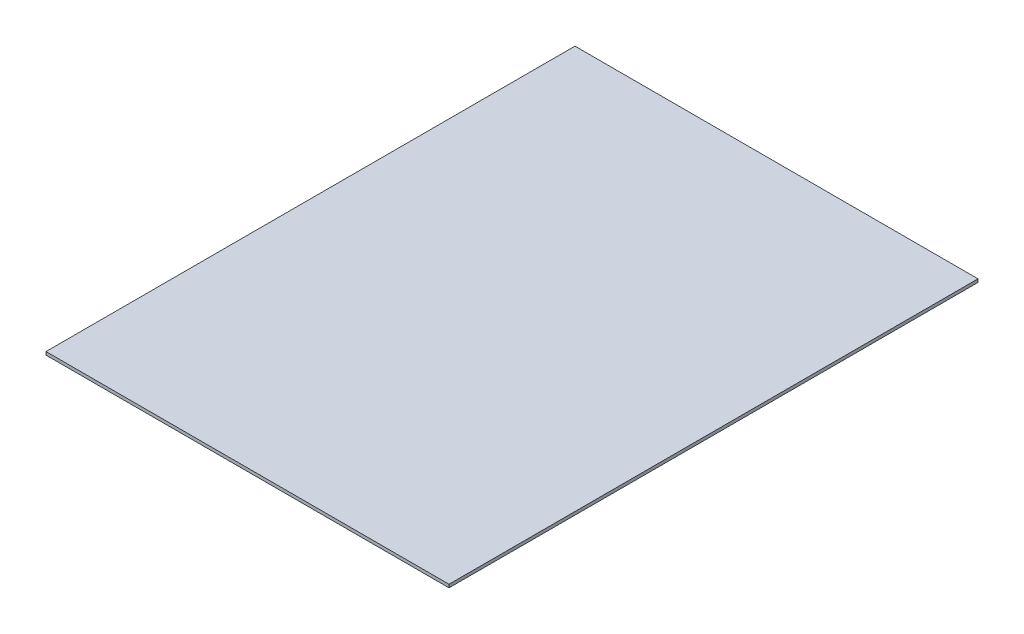
ISO-10303-21;
HEADER;
FILE_DESCRIPTION(('STEP AP214'),'2;1');
FILE_NAME('part.step','',(''),(''),'','','');
FILE_SCHEMA(('AUTOMOTIVE_DESIGN { 1 0 10303 214 1 1 1 1 }'));
ENDSEC;
DATA;
#1=APPLICATION_CONTEXT('core data for automotive mechanical design processes');
#2=APPLICATION_PROTOCOL_DEFINITION('international standard','automotive_design',2000,#1);
#3=PRODUCT_CONTEXT('',#1,'mechanical');
#4=PRODUCT('Part','Part','',(#3));
#5=PRODUCT_RELATED_PRODUCT_CATEGORY('part','',(#4));
#6=PRODUCT_DEFINITION_FORMATION('','',#4);
#7=PRODUCT_DEFINITION_CONTEXT('part definition',#1,'design');
#8=PRODUCT_DEFINITION('design','',#6,#7);
#9=PRODUCT_DEFINITION_SHAPE('','',#8);
#10=(LENGTH_UNIT() NAMED_UNIT(*) SI_UNIT(.MILLI.,.METRE.));
#11=(NAMED_UNIT(*) PLANE_ANGLE_UNIT() SI_UNIT($,.RADIAN.));
#12=(NAMED_UNIT(*) SI_UNIT($,.STERADIAN.) SOLID_ANGLE_UNIT());
#13=UNCERTAINTY_MEASURE_WITH_UNIT(LENGTH_MEASURE(1.E-05),#10,'distance_accuracy_value','');
#14=(GEOMETRIC_REPRESENTATION_CONTEXT(3) GLOBAL_UNCERTAINTY_ASSIGNED_CONTEXT((#13)) GLOBAL_UNIT_ASSIGNED_CONTEXT((#10,
#11,#12)) REPRESENTATION_CONTEXT('',''));
#15=CARTESIAN_POINT('',(0.,0.,0.));
#16=DIRECTION('',(0.,0.,1.));
#17=DIRECTION('',(1.,0.,0.));
#18=AXIS2_PLACEMENT_3D('',#15,#16,#17);
#19=CARTESIAN_POINT('',(203.2,3.175,266.7));
#20=DIRECTION('',(-1.,0.,0.));
#21=DIRECTION('',(0.,0.,1.));
#22=AXIS2_PLACEMENT_3D('',#19,#20,#21);
#23=PLANE('',#22);
#24=DIRECTION('',(0.,0.,-1.));
#25=VECTOR('',#24,1.);
#26=CARTESIAN_POINT('',(203.2,0.,266.7));
#27=LINE('',#26,#25);
#28=CARTESIAN_POINT('',(203.2,0.,266.7));
#29=VERTEX_POINT('',#28);
#30=CARTESIAN_POINT('',(203.2,0.,-266.7));
#31=VERTEX_POINT('',#30);
#32=EDGE_CURVE('E103',#29,#31,#27,.T.);
#33=ORIENTED_EDGE('',*,*,#32,.T.);
#34=DIRECTION('',(0.,-1.,0.));
#35=VECTOR('',#34,1.);
#36=CARTESIAN_POINT('',(203.2,3.175,-266.7));
#37=LINE('',#36,#35);
#38=CARTESIAN_POINT('',(203.2,3.175,-266.7));
#39=VERTEX_POINT('',#38);
#40=EDGE_CURVE('E11',#39,#31,#37,.T.);
#41=ORIENTED_EDGE('',*,*,#40,.F.);
#42=DIRECTION('',(0.,0.,-1.));
#43=VECTOR('',#42,1.);
#44=CARTESIAN_POINT('',(203.2,3.175,266.7));
#45=LINE('',#44,#43);
#46=CARTESIAN_POINT('',(203.2,3.175,266.7));
#47=VERTEX_POINT('',#46);
#48=EDGE_CURVE('E91',#47,#39,#45,.T.);
#49=ORIENTED_EDGE('',*,*,#48,.F.);
#50=DIRECTION('',(0.,-1.,0.));
#51=VECTOR('',#50,1.);
#52=CARTESIAN_POINT('',(203.2,3.175,266.7));
#53=LINE('',#52,#51);
#54=EDGE_CURVE('E99',#47,#29,#53,.T.);
#55=ORIENTED_EDGE('',*,*,#54,.T.);
#56=EDGE_LOOP('',(#33,#41,#49,#55));
#57=FACE_BOUND('',#56,.T.);
#58=ADVANCED_FACE('F40',(#57),#23,.F.);
#59=CARTESIAN_POINT('',(-203.2,3.175,-266.7));
#60=DIRECTION('',(0.,0.,1.));
#61=DIRECTION('',(1.,0.,0.));
#62=AXIS2_PLACEMENT_3D('',#59,#60,#61);
#63=PLANE('',#62);
#64=DIRECTION('',(-1.,0.,0.));
#65=VECTOR('',#64,1.);
#66=CARTESIAN_POINT('',(-203.2,0.,-266.7));
#67=LINE('',#66,#65);
#68=CARTESIAN_POINT('',(-203.2,0.,-266.7));
#69=VERTEX_POINT('',#68);
#70=EDGE_CURVE('E95',#31,#69,#67,.T.);
#71=ORIENTED_EDGE('',*,*,#70,.T.);
#72=DIRECTION('',(0.,-1.,0.));
#73=VECTOR('',#72,1.);
#74=CARTESIAN_POINT('',(-203.2,3.175,-266.7));
#75=LINE('',#74,#73);
#76=CARTESIAN_POINT('',(-203.2,3.175,-266.7));
#77=VERTEX_POINT('',#76);
#78=EDGE_CURVE('E48',#77,#69,#75,.T.);
#79=ORIENTED_EDGE('',*,*,#78,.F.);
#80=DIRECTION('',(-1.,0.,0.));
#81=VECTOR('',#80,1.);
#82=CARTESIAN_POINT('',(-203.2,3.175,-266.7));
#83=LINE('',#82,#81);
#84=EDGE_CURVE('E86',#39,#77,#83,.T.);
#85=ORIENTED_EDGE('',*,*,#84,.F.);
#86=ORIENTED_EDGE('',*,*,#40,.T.);
#87=EDGE_LOOP('',(#71,#79,#85,#86));
#88=FACE_BOUND('',#87,.T.);
#89=ADVANCED_FACE('F94',(#88),#63,.F.);
#90=CARTESIAN_POINT('',(-203.2,3.175,266.7));
#91=DIRECTION('',(1.,0.,0.));
#92=DIRECTION('',(0.,0.,-1.));
#93=AXIS2_PLACEMENT_3D('',#90,#91,#92);
#94=PLANE('',#93);
#95=DIRECTION('',(0.,0.,1.));
#96=VECTOR('',#95,1.);
#97=CARTESIAN_POINT('',(-203.2,0.,266.7));
#98=LINE('',#97,#96);
#99=CARTESIAN_POINT('',(-203.2,0.,266.7));
#100=VERTEX_POINT('',#99);
#101=EDGE_CURVE('E73',#69,#100,#98,.T.);
#102=ORIENTED_EDGE('',*,*,#101,.T.);
#103=DIRECTION('',(0.,-1.,0.));
#104=VECTOR('',#103,1.);
#105=CARTESIAN_POINT('',(-203.2,3.175,266.7));
#106=LINE('',#105,#104);
#107=CARTESIAN_POINT('',(-203.2,3.175,266.7));
#108=VERTEX_POINT('',#107);
#109=EDGE_CURVE('E96',#108,#100,#106,.T.);
#110=ORIENTED_EDGE('',*,*,#109,.F.);
#111=DIRECTION('',(0.,0.,1.));
#112=VECTOR('',#111,1.);
#113=CARTESIAN_POINT('',(-203.2,3.175,266.7));
#114=LINE('',#113,#112);
#115=EDGE_CURVE('E89',#77,#108,#114,.T.);
#116=ORIENTED_EDGE('',*,*,#115,.F.);
#117=ORIENTED_EDGE('',*,*,#78,.T.);
#118=EDGE_LOOP('',(#102,#110,#116,#117));
#119=FACE_BOUND('',#118,.T.);
#120=ADVANCED_FACE('F97',(#119),#94,.F.);
#121=CARTESIAN_POINT('',(-203.2,3.175,266.7));
#122=DIRECTION('',(0.,0.,-1.));
#123=DIRECTION('',(-1.,0.,0.));
#124=AXIS2_PLACEMENT_3D('',#121,#122,#123);
#125=PLANE('',#124);
#126=DIRECTION('',(1.,0.,0.));
#127=VECTOR('',#126,1.);
#128=CARTESIAN_POINT('',(-203.2,0.,266.7));
#129=LINE('',#128,#127);
#130=EDGE_CURVE('E79',#100,#29,#129,.T.);
#131=ORIENTED_EDGE('',*,*,#130,.T.);
#132=ORIENTED_EDGE('',*,*,#54,.F.);
#133=DIRECTION('',(1.,0.,0.));
#134=VECTOR('',#133,1.);
#135=CARTESIAN_POINT('',(-203.2,3.175,266.7));
#136=LINE('',#135,#134);
#137=EDGE_CURVE('E56',#108,#47,#136,.T.);
#138=ORIENTED_EDGE('',*,*,#137,.F.);
#139=ORIENTED_EDGE('',*,*,#109,.T.);
#140=EDGE_LOOP('',(#131,#132,#138,#139));
#141=FACE_BOUND('',#140,.T.);
#142=ADVANCED_FACE('F110',(#141),#125,.F.);
#143=CARTESIAN_POINT('',(0.,3.175,0.));
#144=DIRECTION('',(0.,-1.,0.));
#145=DIRECTION('',(0.,0.,-1.));
#146=AXIS2_PLACEMENT_3D('',#143,#144,#145);
#147=PLANE('',#146);
#148=ORIENTED_EDGE('',*,*,#48,.T.);
#149=ORIENTED_EDGE('',*,*,#84,.T.);
#150=ORIENTED_EDGE('',*,*,#115,.T.);
#151=ORIENTED_EDGE('',*,*,#137,.T.);
#152=EDGE_LOOP('',(#148,#149,#150,#151));
#153=FACE_BOUND('',#152,.T.);
#154=ADVANCED_FACE('F87',(#153),#147,.F.);
#155=CARTESIAN_POINT('',(0.,0.,0.));
#156=DIRECTION('',(0.,-1.,0.));
#157=DIRECTION('',(0.,0.,-1.));
#158=AXIS2_PLACEMENT_3D('',#155,#156,#157);
#159=PLANE('',#158);
#160=ORIENTED_EDGE('',*,*,#32,.F.);
#161=ORIENTED_EDGE('',*,*,#130,.F.);
#162=ORIENTED_EDGE('',*,*,#101,.F.);
#163=ORIENTED_EDGE('',*,*,#70,.F.);
#164=EDGE_LOOP('',(#160,#161,#162,#163));
#165=FACE_BOUND('',#164,.T.);
#166=ADVANCED_FACE('F113',(#165),#159,.T.);
#167=CLOSED_SHELL('',(#58,#89,#120,#142,#154,#166));
#168=MANIFOLD_SOLID_BREP('B2',#167);
#169=ADVANCED_BREP_SHAPE_REPRESENTATION('',(#18,#168),#14);
#170=SHAPE_DEFINITION_REPRESENTATION(#9,#169);
ENDSEC;
END-ISO-10303-21;
